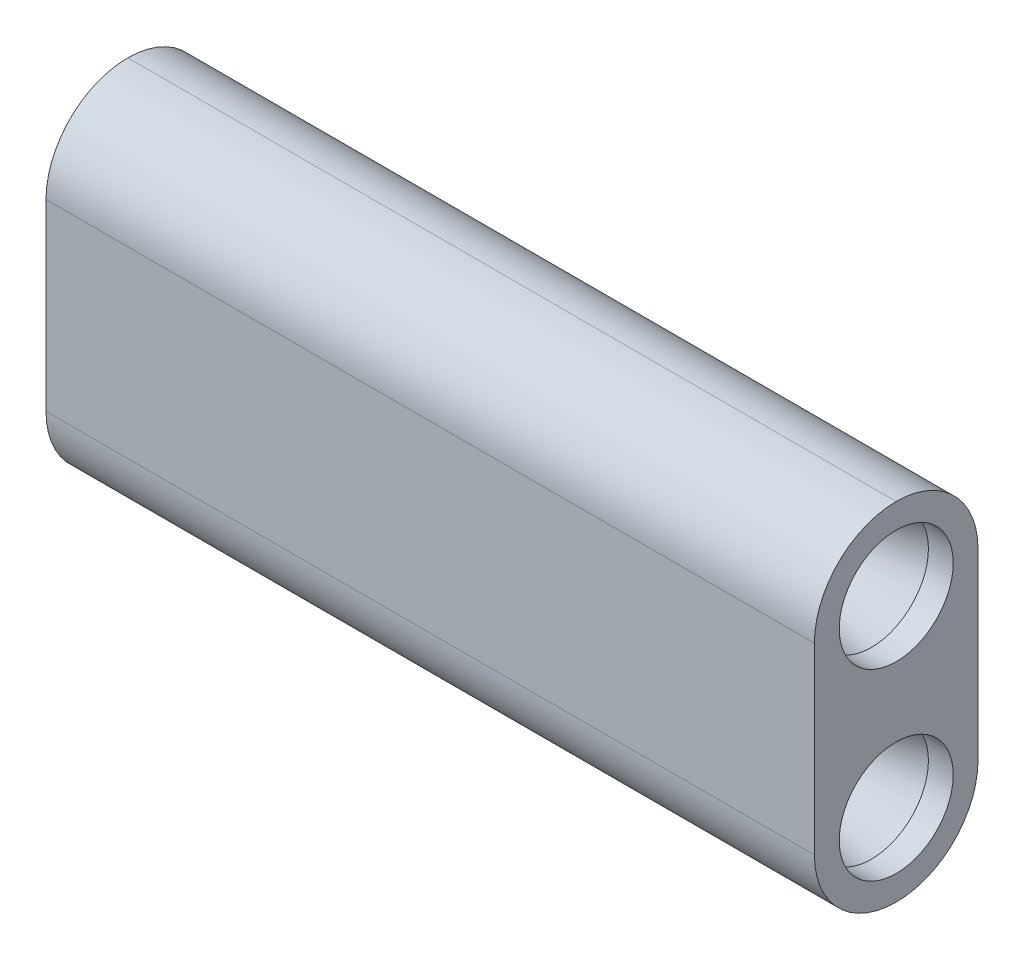
ISO-10303-21;
HEADER;
FILE_DESCRIPTION(('STEP AP214'),'2;1');
FILE_NAME('part.step','',(''),(''),'','','');
FILE_SCHEMA(('AUTOMOTIVE_DESIGN { 1 0 10303 214 1 1 1 1 }'));
ENDSEC;
DATA;
#1=APPLICATION_CONTEXT('core data for automotive mechanical design processes');
#2=APPLICATION_PROTOCOL_DEFINITION('international standard','automotive_design',2000,#1);
#3=PRODUCT_CONTEXT('',#1,'mechanical');
#4=PRODUCT('Part','Part','',(#3));
#5=PRODUCT_RELATED_PRODUCT_CATEGORY('part','',(#4));
#6=PRODUCT_DEFINITION_FORMATION('','',#4);
#7=PRODUCT_DEFINITION_CONTEXT('part definition',#1,'design');
#8=PRODUCT_DEFINITION('design','',#6,#7);
#9=PRODUCT_DEFINITION_SHAPE('','',#8);
#10=(LENGTH_UNIT() NAMED_UNIT(*) SI_UNIT(.MILLI.,.METRE.));
#11=(NAMED_UNIT(*) PLANE_ANGLE_UNIT() SI_UNIT($,.RADIAN.));
#12=(NAMED_UNIT(*) SI_UNIT($,.STERADIAN.) SOLID_ANGLE_UNIT());
#13=UNCERTAINTY_MEASURE_WITH_UNIT(LENGTH_MEASURE(1.E-05),#10,'distance_accuracy_value','');
#14=(GEOMETRIC_REPRESENTATION_CONTEXT(3) GLOBAL_UNCERTAINTY_ASSIGNED_CONTEXT((#13)) GLOBAL_UNIT_ASSIGNED_CONTEXT((#10,
#11,#12)) REPRESENTATION_CONTEXT('',''));
#15=CARTESIAN_POINT('',(0.,0.,0.));
#16=DIRECTION('',(0.,0.,1.));
#17=DIRECTION('',(1.,0.,0.));
#18=AXIS2_PLACEMENT_3D('',#15,#16,#17);
#19=CARTESIAN_POINT('',(0.,3.3,3.3));
#20=DIRECTION('',(1.,0.,0.));
#21=DIRECTION('',(0.,0.,-1.));
#22=AXIS2_PLACEMENT_3D('',#19,#20,#21);
#23=CYLINDRICAL_SURFACE('',#22,3.3);
#24=DIRECTION('',(-1.,0.,0.));
#25=VECTOR('',#24,1.);
#26=CARTESIAN_POINT('',(0.,3.3,0.));
#27=LINE('',#26,#25);
#28=CARTESIAN_POINT('',(31.,3.3,0.));
#29=VERTEX_POINT('',#28);
#30=CARTESIAN_POINT('',(0.,3.3,0.));
#31=VERTEX_POINT('',#30);
#32=EDGE_CURVE('E129',#29,#31,#27,.T.);
#33=ORIENTED_EDGE('',*,*,#32,.F.);
#34=CARTESIAN_POINT('',(31.,3.3,3.3));
#35=DIRECTION('',(-1.,0.,0.));
#36=DIRECTION('',(0.,0.,1.));
#37=AXIS2_PLACEMENT_3D('',#34,#35,#36);
#38=CIRCLE('',#37,3.3);
#39=CARTESIAN_POINT('',(31.,0.,3.3));
#40=VERTEX_POINT('',#39);
#41=EDGE_CURVE('E40',#40,#29,#38,.F.);
#42=ORIENTED_EDGE('',*,*,#41,.F.);
#43=DIRECTION('',(1.,0.,0.));
#44=VECTOR('',#43,1.);
#45=CARTESIAN_POINT('',(0.,0.,3.3));
#46=LINE('',#45,#44);
#47=CARTESIAN_POINT('',(0.,0.,3.3));
#48=VERTEX_POINT('',#47);
#49=EDGE_CURVE('E123',#40,#48,#46,.F.);
#50=ORIENTED_EDGE('',*,*,#49,.T.);
#51=CARTESIAN_POINT('',(0.,3.3,3.3));
#52=DIRECTION('',(1.,0.,0.));
#53=DIRECTION('',(0.,0.,-1.));
#54=AXIS2_PLACEMENT_3D('',#51,#52,#53);
#55=CIRCLE('',#54,3.3);
#56=EDGE_CURVE('E11',#31,#48,#55,.F.);
#57=ORIENTED_EDGE('',*,*,#56,.F.);
#58=EDGE_LOOP('',(#33,#42,#50,#57));
#59=FACE_BOUND('',#58,.T.);
#60=ADVANCED_FACE('F33',(#59),#23,.T.);
#61=CARTESIAN_POINT('',(0.,3.3,3.3));
#62=DIRECTION('',(1.,0.,0.));
#63=DIRECTION('',(0.,0.,-1.));
#64=AXIS2_PLACEMENT_3D('',#61,#62,#63);
#65=CYLINDRICAL_SURFACE('',#64,3.3);
#66=DIRECTION('',(1.,0.,0.));
#67=VECTOR('',#66,1.);
#68=CARTESIAN_POINT('',(0.,3.3,6.6));
#69=LINE('',#68,#67);
#70=CARTESIAN_POINT('',(0.,3.3,6.6));
#71=VERTEX_POINT('',#70);
#72=CARTESIAN_POINT('',(31.,3.3,6.6));
#73=VERTEX_POINT('',#72);
#74=EDGE_CURVE('E120',#71,#73,#69,.T.);
#75=ORIENTED_EDGE('',*,*,#74,.F.);
#76=CARTESIAN_POINT('',(0.,3.3,3.3));
#77=DIRECTION('',(1.,0.,0.));
#78=DIRECTION('',(0.,0.,-1.));
#79=AXIS2_PLACEMENT_3D('',#76,#77,#78);
#80=CIRCLE('',#79,3.3);
#81=EDGE_CURVE('E125',#48,#71,#80,.F.);
#82=ORIENTED_EDGE('',*,*,#81,.F.);
#83=ORIENTED_EDGE('',*,*,#49,.F.);
#84=CARTESIAN_POINT('',(31.,3.3,3.3));
#85=DIRECTION('',(-1.,0.,0.));
#86=DIRECTION('',(0.,0.,1.));
#87=AXIS2_PLACEMENT_3D('',#84,#85,#86);
#88=CIRCLE('',#87,3.3);
#89=EDGE_CURVE('E127',#73,#40,#88,.F.);
#90=ORIENTED_EDGE('',*,*,#89,.F.);
#91=EDGE_LOOP('',(#75,#82,#83,#90));
#92=FACE_BOUND('',#91,.T.);
#93=ADVANCED_FACE('F193',(#92),#65,.T.);
#94=CARTESIAN_POINT('',(0.,10.7,3.3));
#95=DIRECTION('',(1.,0.,0.));
#96=DIRECTION('',(0.,0.,-1.));
#97=AXIS2_PLACEMENT_3D('',#94,#95,#96);
#98=CYLINDRICAL_SURFACE('',#97,3.3);
#99=DIRECTION('',(-1.,0.,0.));
#100=VECTOR('',#99,1.);
#101=CARTESIAN_POINT('',(0.,14.,3.3));
#102=LINE('',#101,#100);
#103=CARTESIAN_POINT('',(31.,14.,3.3));
#104=VERTEX_POINT('',#103);
#105=CARTESIAN_POINT('',(0.,14.,3.3));
#106=VERTEX_POINT('',#105);
#107=EDGE_CURVE('E100',#104,#106,#102,.T.);
#108=ORIENTED_EDGE('',*,*,#107,.T.);
#109=CARTESIAN_POINT('',(0.,10.7,3.3));
#110=DIRECTION('',(1.,0.,0.));
#111=DIRECTION('',(0.,0.,-1.));
#112=AXIS2_PLACEMENT_3D('',#109,#110,#111);
#113=CIRCLE('',#112,3.3);
#114=CARTESIAN_POINT('',(0.,10.7,6.6));
#115=VERTEX_POINT('',#114);
#116=EDGE_CURVE('E81',#115,#106,#113,.F.);
#117=ORIENTED_EDGE('',*,*,#116,.F.);
#118=DIRECTION('',(1.,0.,0.));
#119=VECTOR('',#118,1.);
#120=CARTESIAN_POINT('',(0.,10.7,6.6));
#121=LINE('',#120,#119);
#122=CARTESIAN_POINT('',(31.,10.7,6.6));
#123=VERTEX_POINT('',#122);
#124=EDGE_CURVE('E94',#123,#115,#121,.F.);
#125=ORIENTED_EDGE('',*,*,#124,.F.);
#126=CARTESIAN_POINT('',(31.,10.7,3.3));
#127=DIRECTION('',(-1.,0.,0.));
#128=DIRECTION('',(0.,0.,1.));
#129=AXIS2_PLACEMENT_3D('',#126,#127,#128);
#130=CIRCLE('',#129,3.3);
#131=EDGE_CURVE('E93',#104,#123,#130,.F.);
#132=ORIENTED_EDGE('',*,*,#131,.F.);
#133=EDGE_LOOP('',(#108,#117,#125,#132));
#134=FACE_BOUND('',#133,.T.);
#135=ADVANCED_FACE('F106',(#134),#98,.T.);
#136=CARTESIAN_POINT('',(0.,10.7,3.3));
#137=DIRECTION('',(1.,0.,0.));
#138=DIRECTION('',(0.,0.,-1.));
#139=AXIS2_PLACEMENT_3D('',#136,#137,#138);
#140=CYLINDRICAL_SURFACE('',#139,3.3);
#141=ORIENTED_EDGE('',*,*,#107,.F.);
#142=CARTESIAN_POINT('',(31.,10.7,3.3));
#143=DIRECTION('',(-1.,0.,0.));
#144=DIRECTION('',(0.,0.,1.));
#145=AXIS2_PLACEMENT_3D('',#142,#143,#144);
#146=CIRCLE('',#145,3.3);
#147=CARTESIAN_POINT('',(31.,10.7,0.));
#148=VERTEX_POINT('',#147);
#149=EDGE_CURVE('E104',#148,#104,#146,.F.);
#150=ORIENTED_EDGE('',*,*,#149,.F.);
#151=DIRECTION('',(-1.,0.,0.));
#152=VECTOR('',#151,1.);
#153=CARTESIAN_POINT('',(0.,10.7,0.));
#154=LINE('',#153,#152);
#155=CARTESIAN_POINT('',(0.,10.7,0.));
#156=VERTEX_POINT('',#155);
#157=EDGE_CURVE('E102',#156,#148,#154,.F.);
#158=ORIENTED_EDGE('',*,*,#157,.F.);
#159=CARTESIAN_POINT('',(0.,10.7,3.3));
#160=DIRECTION('',(1.,0.,0.));
#161=DIRECTION('',(0.,0.,-1.));
#162=AXIS2_PLACEMENT_3D('',#159,#160,#161);
#163=CIRCLE('',#162,3.3);
#164=EDGE_CURVE('E85',#106,#156,#163,.F.);
#165=ORIENTED_EDGE('',*,*,#164,.F.);
#166=EDGE_LOOP('',(#141,#150,#158,#165));
#167=FACE_BOUND('',#166,.T.);
#168=ADVANCED_FACE('F98',(#167),#140,.T.);
#169=CARTESIAN_POINT('',(0.,0.,6.6));
#170=DIRECTION('',(1.,0.,0.));
#171=DIRECTION('',(0.,0.,-1.));
#172=AXIS2_PLACEMENT_3D('',#169,#170,#171);
#173=PLANE('',#172);
#174=CARTESIAN_POINT('',(0.,3.3,3.3));
#175=DIRECTION('',(-1.,0.,0.));
#176=DIRECTION('',(0.,0.,1.));
#177=AXIS2_PLACEMENT_3D('',#174,#175,#176);
#178=CIRCLE('',#177,2.3);
#179=CARTESIAN_POINT('',(0.,3.3,5.6));
#180=VERTEX_POINT('',#179);
#181=EDGE_CURVE('E135',#180,#180,#178,.T.);
#182=ORIENTED_EDGE('',*,*,#181,.F.);
#183=EDGE_LOOP('',(#182));
#184=FACE_BOUND('',#183,.T.);
#185=CARTESIAN_POINT('',(0.,10.7,3.3));
#186=DIRECTION('',(-1.,0.,0.));
#187=DIRECTION('',(0.,0.,1.));
#188=AXIS2_PLACEMENT_3D('',#185,#186,#187);
#189=CIRCLE('',#188,2.3);
#190=CARTESIAN_POINT('',(0.,10.7,5.6));
#191=VERTEX_POINT('',#190);
#192=EDGE_CURVE('E137',#191,#191,#189,.T.);
#193=ORIENTED_EDGE('',*,*,#192,.F.);
#194=EDGE_LOOP('',(#193));
#195=FACE_BOUND('',#194,.T.);
#196=DIRECTION('',(0.,-1.,0.));
#197=VECTOR('',#196,1.);
#198=CARTESIAN_POINT('',(0.,0.,0.));
#199=LINE('',#198,#197);
#200=EDGE_CURVE('E133',#156,#31,#199,.T.);
#201=ORIENTED_EDGE('',*,*,#200,.T.);
#202=ORIENTED_EDGE('',*,*,#56,.T.);
#203=ORIENTED_EDGE('',*,*,#81,.T.);
#204=DIRECTION('',(0.,-1.,0.));
#205=VECTOR('',#204,1.);
#206=CARTESIAN_POINT('',(0.,0.,6.6));
#207=LINE('',#206,#205);
#208=EDGE_CURVE('E88',#115,#71,#207,.T.);
#209=ORIENTED_EDGE('',*,*,#208,.F.);
#210=ORIENTED_EDGE('',*,*,#116,.T.);
#211=ORIENTED_EDGE('',*,*,#164,.T.);
#212=EDGE_LOOP('',(#201,#202,#203,#209,#210,#211));
#213=FACE_BOUND('',#212,.T.);
#214=ADVANCED_FACE('F84',(#184,#195,#213),#173,.F.);
#215=CARTESIAN_POINT('',(31.,0.,6.6));
#216=DIRECTION('',(-1.,0.,0.));
#217=DIRECTION('',(0.,0.,1.));
#218=AXIS2_PLACEMENT_3D('',#215,#216,#217);
#219=PLANE('',#218);
#220=CARTESIAN_POINT('',(31.,10.7,3.3));
#221=DIRECTION('',(1.,0.,0.));
#222=DIRECTION('',(0.,0.,-1.));
#223=AXIS2_PLACEMENT_3D('',#220,#221,#222);
#224=CIRCLE('',#223,2.3);
#225=CARTESIAN_POINT('',(31.,10.7,1.));
#226=VERTEX_POINT('',#225);
#227=EDGE_CURVE('E142',#226,#226,#224,.T.);
#228=ORIENTED_EDGE('',*,*,#227,.F.);
#229=EDGE_LOOP('',(#228));
#230=FACE_BOUND('',#229,.T.);
#231=CARTESIAN_POINT('',(31.,3.3,3.3));
#232=DIRECTION('',(1.,0.,0.));
#233=DIRECTION('',(0.,0.,-1.));
#234=AXIS2_PLACEMENT_3D('',#231,#232,#233);
#235=CIRCLE('',#234,2.3);
#236=CARTESIAN_POINT('',(31.,3.3,1.));
#237=VERTEX_POINT('',#236);
#238=EDGE_CURVE('E144',#237,#237,#235,.T.);
#239=ORIENTED_EDGE('',*,*,#238,.F.);
#240=EDGE_LOOP('',(#239));
#241=FACE_BOUND('',#240,.T.);
#242=ORIENTED_EDGE('',*,*,#89,.T.);
#243=ORIENTED_EDGE('',*,*,#41,.T.);
#244=DIRECTION('',(0.,1.,0.));
#245=VECTOR('',#244,1.);
#246=CARTESIAN_POINT('',(31.,0.,0.));
#247=LINE('',#246,#245);
#248=EDGE_CURVE('E114',#29,#148,#247,.T.);
#249=ORIENTED_EDGE('',*,*,#248,.T.);
#250=ORIENTED_EDGE('',*,*,#149,.T.);
#251=ORIENTED_EDGE('',*,*,#131,.T.);
#252=DIRECTION('',(0.,1.,0.));
#253=VECTOR('',#252,1.);
#254=CARTESIAN_POINT('',(31.,0.,6.6));
#255=LINE('',#254,#253);
#256=EDGE_CURVE('E109',#73,#123,#255,.T.);
#257=ORIENTED_EDGE('',*,*,#256,.F.);
#258=EDGE_LOOP('',(#242,#243,#249,#250,#251,#257));
#259=FACE_BOUND('',#258,.T.);
#260=ADVANCED_FACE('F184',(#230,#241,#259),#219,.F.);
#261=CARTESIAN_POINT('',(0.,0.,6.6));
#262=DIRECTION('',(0.,0.,-1.));
#263=DIRECTION('',(-1.,0.,0.));
#264=AXIS2_PLACEMENT_3D('',#261,#262,#263);
#265=PLANE('',#264);
#266=ORIENTED_EDGE('',*,*,#208,.T.);
#267=ORIENTED_EDGE('',*,*,#74,.T.);
#268=ORIENTED_EDGE('',*,*,#256,.T.);
#269=ORIENTED_EDGE('',*,*,#124,.T.);
#270=EDGE_LOOP('',(#266,#267,#268,#269));
#271=FACE_BOUND('',#270,.T.);
#272=ADVANCED_FACE('F186',(#271),#265,.F.);
#273=CARTESIAN_POINT('',(0.,0.,0.));
#274=DIRECTION('',(0.,0.,-1.));
#275=DIRECTION('',(-1.,0.,0.));
#276=AXIS2_PLACEMENT_3D('',#273,#274,#275);
#277=PLANE('',#276);
#278=ORIENTED_EDGE('',*,*,#248,.F.);
#279=ORIENTED_EDGE('',*,*,#32,.T.);
#280=ORIENTED_EDGE('',*,*,#200,.F.);
#281=ORIENTED_EDGE('',*,*,#157,.T.);
#282=EDGE_LOOP('',(#278,#279,#280,#281));
#283=FACE_BOUND('',#282,.T.);
#284=ADVANCED_FACE('F132',(#283),#277,.T.);
#285=CARTESIAN_POINT('',(1.,10.7,3.3));
#286=DIRECTION('',(-1.,0.,0.));
#287=DIRECTION('',(0.,0.,1.));
#288=AXIS2_PLACEMENT_3D('',#285,#286,#287);
#289=CYLINDRICAL_SURFACE('',#288,2.3);
#290=CARTESIAN_POINT('',(1.,10.7,3.3));
#291=DIRECTION('',(-1.,0.,0.));
#292=DIRECTION('',(0.,0.,1.));
#293=AXIS2_PLACEMENT_3D('',#290,#291,#292);
#294=CIRCLE('',#293,2.3);
#295=CARTESIAN_POINT('',(1.,10.7,5.6));
#296=VERTEX_POINT('',#295);
#297=EDGE_CURVE('E152',#296,#296,#294,.T.);
#298=ORIENTED_EDGE('',*,*,#297,.F.);
#299=EDGE_LOOP('',(#298));
#300=FACE_BOUND('',#299,.T.);
#301=ORIENTED_EDGE('',*,*,#192,.T.);
#302=EDGE_LOOP('',(#301));
#303=FACE_BOUND('',#302,.T.);
#304=ADVANCED_FACE('F210',(#300,#303),#289,.F.);
#305=CARTESIAN_POINT('',(1.,3.3,3.3));
#306=DIRECTION('',(-1.,0.,0.));
#307=DIRECTION('',(0.,0.,1.));
#308=AXIS2_PLACEMENT_3D('',#305,#306,#307);
#309=CYLINDRICAL_SURFACE('',#308,2.3);
#310=CARTESIAN_POINT('',(1.,3.3,3.3));
#311=DIRECTION('',(-1.,0.,0.));
#312=DIRECTION('',(0.,0.,1.));
#313=AXIS2_PLACEMENT_3D('',#310,#311,#312);
#314=CIRCLE('',#313,2.3);
#315=CARTESIAN_POINT('',(1.,3.3,5.6));
#316=VERTEX_POINT('',#315);
#317=EDGE_CURVE('E158',#316,#316,#314,.T.);
#318=ORIENTED_EDGE('',*,*,#317,.F.);
#319=EDGE_LOOP('',(#318));
#320=FACE_BOUND('',#319,.T.);
#321=ORIENTED_EDGE('',*,*,#181,.T.);
#322=EDGE_LOOP('',(#321));
#323=FACE_BOUND('',#322,.T.);
#324=ADVANCED_FACE('F180',(#320,#323),#309,.F.);
#325=CARTESIAN_POINT('',(30.,3.3,3.3));
#326=DIRECTION('',(1.,0.,0.));
#327=DIRECTION('',(0.,0.,-1.));
#328=AXIS2_PLACEMENT_3D('',#325,#326,#327);
#329=CYLINDRICAL_SURFACE('',#328,2.3);
#330=CARTESIAN_POINT('',(30.,3.3,3.3));
#331=DIRECTION('',(1.,0.,0.));
#332=DIRECTION('',(0.,0.,-1.));
#333=AXIS2_PLACEMENT_3D('',#330,#331,#332);
#334=CIRCLE('',#333,2.3);
#335=CARTESIAN_POINT('',(30.,3.3,1.));
#336=VERTEX_POINT('',#335);
#337=EDGE_CURVE('E170',#336,#336,#334,.T.);
#338=ORIENTED_EDGE('',*,*,#337,.F.);
#339=EDGE_LOOP('',(#338));
#340=FACE_BOUND('',#339,.T.);
#341=ORIENTED_EDGE('',*,*,#238,.T.);
#342=EDGE_LOOP('',(#341));
#343=FACE_BOUND('',#342,.T.);
#344=ADVANCED_FACE('F176',(#340,#343),#329,.F.);
#345=CARTESIAN_POINT('',(30.,10.7,3.3));
#346=DIRECTION('',(1.,0.,0.));
#347=DIRECTION('',(0.,0.,-1.));
#348=AXIS2_PLACEMENT_3D('',#345,#346,#347);
#349=CYLINDRICAL_SURFACE('',#348,2.3);
#350=CARTESIAN_POINT('',(30.,10.7,3.3));
#351=DIRECTION('',(1.,0.,0.));
#352=DIRECTION('',(0.,0.,-1.));
#353=AXIS2_PLACEMENT_3D('',#350,#351,#352);
#354=CIRCLE('',#353,2.3);
#355=CARTESIAN_POINT('',(30.,10.7,1.));
#356=VERTEX_POINT('',#355);
#357=EDGE_CURVE('E164',#356,#356,#354,.T.);
#358=ORIENTED_EDGE('',*,*,#357,.F.);
#359=EDGE_LOOP('',(#358));
#360=FACE_BOUND('',#359,.T.);
#361=ORIENTED_EDGE('',*,*,#227,.T.);
#362=EDGE_LOOP('',(#361));
#363=FACE_BOUND('',#362,.T.);
#364=ADVANCED_FACE('F179',(#360,#363),#349,.F.);
#365=CARTESIAN_POINT('',(1.,10.7,3.3));
#366=DIRECTION('',(-1.,0.,0.));
#367=DIRECTION('',(0.,0.,1.));
#368=AXIS2_PLACEMENT_3D('',#365,#366,#367);
#369=CONICAL_SURFACE('',#368,2.3,0.26179938779915);
#370=CARTESIAN_POINT('',(4.,10.7,3.3));
#371=DIRECTION('',(-1.,0.,0.));
#372=DIRECTION('',(0.,0.,1.));
#373=AXIS2_PLACEMENT_3D('',#370,#371,#372);
#374=CIRCLE('',#373,1.49615242270663);
#375=CARTESIAN_POINT('',(4.,10.7,4.79615242270663));
#376=VERTEX_POINT('',#375);
#377=EDGE_CURVE('E147',#376,#376,#374,.T.);
#378=ORIENTED_EDGE('',*,*,#377,.F.);
#379=EDGE_LOOP('',(#378));
#380=FACE_BOUND('',#379,.T.);
#381=ORIENTED_EDGE('',*,*,#297,.T.);
#382=EDGE_LOOP('',(#381));
#383=FACE_BOUND('',#382,.T.);
#384=ADVANCED_FACE('F222',(#380,#383),#369,.F.);
#385=CARTESIAN_POINT('',(4.,10.7,3.3));
#386=DIRECTION('',(-1.,0.,0.));
#387=DIRECTION('',(0.,0.,1.));
#388=AXIS2_PLACEMENT_3D('',#385,#386,#387);
#389=PLANE('',#388);
#390=ORIENTED_EDGE('',*,*,#377,.T.);
#391=EDGE_LOOP('',(#390));
#392=FACE_BOUND('',#391,.T.);
#393=ADVANCED_FACE('F226',(#392),#389,.T.);
#394=CARTESIAN_POINT('',(1.,3.3,3.3));
#395=DIRECTION('',(-1.,0.,0.));
#396=DIRECTION('',(0.,0.,1.));
#397=AXIS2_PLACEMENT_3D('',#394,#395,#396);
#398=CONICAL_SURFACE('',#397,2.3,0.26179938779915);
#399=CARTESIAN_POINT('',(4.,3.3,3.3));
#400=DIRECTION('',(-1.,0.,0.));
#401=DIRECTION('',(0.,0.,1.));
#402=AXIS2_PLACEMENT_3D('',#399,#400,#401);
#403=CIRCLE('',#402,1.49615242270663);
#404=CARTESIAN_POINT('',(4.,3.3,4.79615242270663));
#405=VERTEX_POINT('',#404);
#406=EDGE_CURVE('E155',#405,#405,#403,.T.);
#407=ORIENTED_EDGE('',*,*,#406,.F.);
#408=EDGE_LOOP('',(#407));
#409=FACE_BOUND('',#408,.T.);
#410=ORIENTED_EDGE('',*,*,#317,.T.);
#411=EDGE_LOOP('',(#410));
#412=FACE_BOUND('',#411,.T.);
#413=ADVANCED_FACE('F230',(#409,#412),#398,.F.);
#414=CARTESIAN_POINT('',(4.,3.3,3.3));
#415=DIRECTION('',(-1.,0.,0.));
#416=DIRECTION('',(0.,0.,1.));
#417=AXIS2_PLACEMENT_3D('',#414,#415,#416);
#418=PLANE('',#417);
#419=ORIENTED_EDGE('',*,*,#406,.T.);
#420=EDGE_LOOP('',(#419));
#421=FACE_BOUND('',#420,.T.);
#422=ADVANCED_FACE('F234',(#421),#418,.T.);
#423=CARTESIAN_POINT('',(30.,10.7,3.3));
#424=DIRECTION('',(1.,0.,0.));
#425=DIRECTION('',(0.,0.,-1.));
#426=AXIS2_PLACEMENT_3D('',#423,#424,#425);
#427=CONICAL_SURFACE('',#426,2.3,0.26179938779915);
#428=CARTESIAN_POINT('',(27.,10.7,3.3));
#429=DIRECTION('',(1.,0.,0.));
#430=DIRECTION('',(0.,0.,-1.));
#431=AXIS2_PLACEMENT_3D('',#428,#429,#430);
#432=CIRCLE('',#431,1.49615242270663);
#433=CARTESIAN_POINT('',(27.,10.7,1.80384757729337));
#434=VERTEX_POINT('',#433);
#435=EDGE_CURVE('E161',#434,#434,#432,.T.);
#436=ORIENTED_EDGE('',*,*,#435,.F.);
#437=EDGE_LOOP('',(#436));
#438=FACE_BOUND('',#437,.T.);
#439=ORIENTED_EDGE('',*,*,#357,.T.);
#440=EDGE_LOOP('',(#439));
#441=FACE_BOUND('',#440,.T.);
#442=ADVANCED_FACE('F238',(#438,#441),#427,.F.);
#443=CARTESIAN_POINT('',(27.,10.7,3.3));
#444=DIRECTION('',(1.,0.,0.));
#445=DIRECTION('',(0.,0.,-1.));
#446=AXIS2_PLACEMENT_3D('',#443,#444,#445);
#447=PLANE('',#446);
#448=ORIENTED_EDGE('',*,*,#435,.T.);
#449=EDGE_LOOP('',(#448));
#450=FACE_BOUND('',#449,.T.);
#451=ADVANCED_FACE('F242',(#450),#447,.T.);
#452=CARTESIAN_POINT('',(30.,3.3,3.3));
#453=DIRECTION('',(1.,0.,0.));
#454=DIRECTION('',(0.,0.,-1.));
#455=AXIS2_PLACEMENT_3D('',#452,#453,#454);
#456=CONICAL_SURFACE('',#455,2.3,0.26179938779915);
#457=CARTESIAN_POINT('',(27.,3.3,3.3));
#458=DIRECTION('',(1.,0.,0.));
#459=DIRECTION('',(0.,0.,-1.));
#460=AXIS2_PLACEMENT_3D('',#457,#458,#459);
#461=CIRCLE('',#460,1.49615242270663);
#462=CARTESIAN_POINT('',(27.,3.3,1.80384757729337));
#463=VERTEX_POINT('',#462);
#464=EDGE_CURVE('E167',#463,#463,#461,.T.);
#465=ORIENTED_EDGE('',*,*,#464,.F.);
#466=EDGE_LOOP('',(#465));
#467=FACE_BOUND('',#466,.T.);
#468=ORIENTED_EDGE('',*,*,#337,.T.);
#469=EDGE_LOOP('',(#468));
#470=FACE_BOUND('',#469,.T.);
#471=ADVANCED_FACE('F174',(#467,#470),#456,.F.);
#472=CARTESIAN_POINT('',(27.,3.3,3.3));
#473=DIRECTION('',(1.,0.,0.));
#474=DIRECTION('',(0.,0.,-1.));
#475=AXIS2_PLACEMENT_3D('',#472,#473,#474);
#476=PLANE('',#475);
#477=ORIENTED_EDGE('',*,*,#464,.T.);
#478=EDGE_LOOP('',(#477));
#479=FACE_BOUND('',#478,.T.);
#480=ADVANCED_FACE('F249',(#479),#476,.T.);
#481=CLOSED_SHELL('',(#60,#93,#135,#168,#214,#260,#272,#284,#304,#324,#344,#364,#384,#393,#413,
#422,#442,#451,#471,#480));
#482=MANIFOLD_SOLID_BREP('B2',#481);
#483=ADVANCED_BREP_SHAPE_REPRESENTATION('',(#18,#482),#14);
#484=SHAPE_DEFINITION_REPRESENTATION(#9,#483);
ENDSEC;
END-ISO-10303-21;
